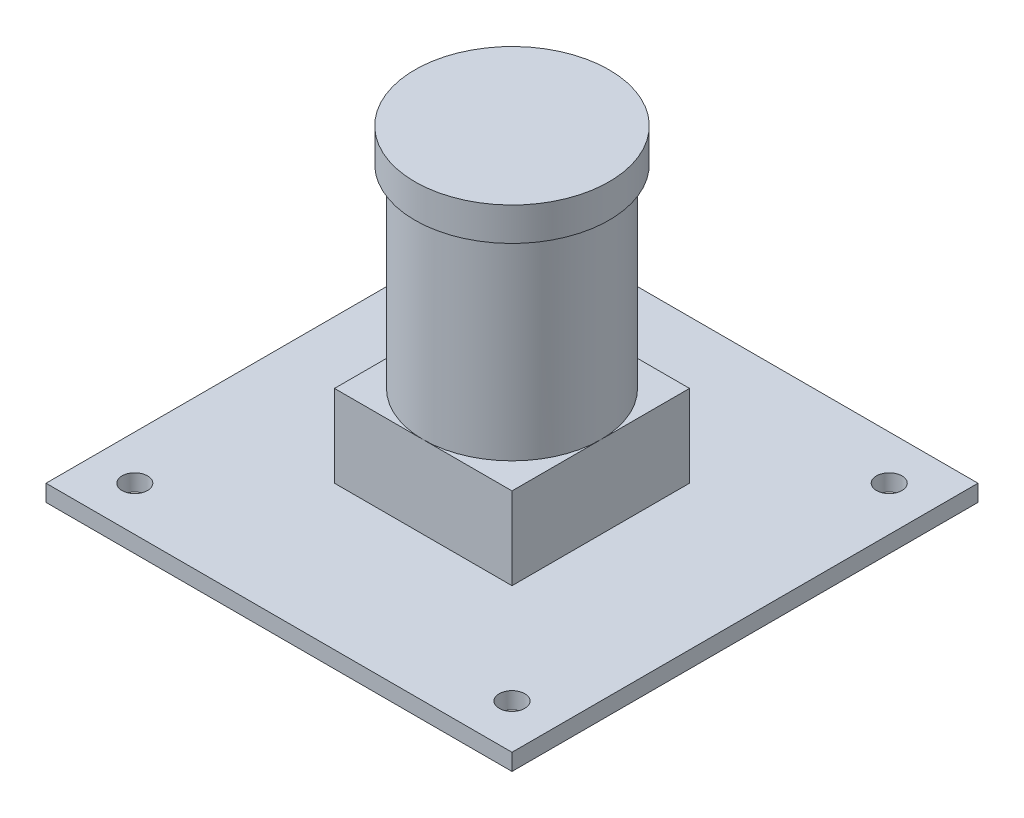
ISO-10303-21;
HEADER;
FILE_DESCRIPTION(('STEP AP214'),'2;1');
FILE_NAME('part.step','',(''),(''),'','','');
FILE_SCHEMA(('AUTOMOTIVE_DESIGN { 1 0 10303 214 1 1 1 1 }'));
ENDSEC;
DATA;
#1=APPLICATION_CONTEXT('core data for automotive mechanical design processes');
#2=APPLICATION_PROTOCOL_DEFINITION('international standard','automotive_design',2000,#1);
#3=PRODUCT_CONTEXT('',#1,'mechanical');
#4=PRODUCT('Part','Part','',(#3));
#5=PRODUCT_RELATED_PRODUCT_CATEGORY('part','',(#4));
#6=PRODUCT_DEFINITION_FORMATION('','',#4);
#7=PRODUCT_DEFINITION_CONTEXT('part definition',#1,'design');
#8=PRODUCT_DEFINITION('design','',#6,#7);
#9=PRODUCT_DEFINITION_SHAPE('','',#8);
#10=(LENGTH_UNIT() NAMED_UNIT(*) SI_UNIT(.MILLI.,.METRE.));
#11=(NAMED_UNIT(*) PLANE_ANGLE_UNIT() SI_UNIT($,.RADIAN.));
#12=(NAMED_UNIT(*) SI_UNIT($,.STERADIAN.) SOLID_ANGLE_UNIT());
#13=UNCERTAINTY_MEASURE_WITH_UNIT(LENGTH_MEASURE(1.E-05),#10,'distance_accuracy_value','');
#14=(GEOMETRIC_REPRESENTATION_CONTEXT(3) GLOBAL_UNCERTAINTY_ASSIGNED_CONTEXT((#13)) GLOBAL_UNIT_ASSIGNED_CONTEXT((#10,
#11,#12)) REPRESENTATION_CONTEXT('',''));
#15=CARTESIAN_POINT('',(0.,0.,0.));
#16=DIRECTION('',(0.,0.,1.));
#17=DIRECTION('',(1.,0.,0.));
#18=AXIS2_PLACEMENT_3D('',#15,#16,#17);
#19=CARTESIAN_POINT('',(0.,1.5,0.));
#20=DIRECTION('',(0.,1.,0.));
#21=DIRECTION('',(0.,0.,1.));
#22=AXIS2_PLACEMENT_3D('',#19,#20,#21);
#23=PLANE('',#22);
#24=CARTESIAN_POINT('',(17.,1.5,-17.));
#25=DIRECTION('',(0.,1.,0.));
#26=DIRECTION('',(0.,0.,1.));
#27=AXIS2_PLACEMENT_3D('',#24,#25,#26);
#28=CIRCLE('',#27,1.15);
#29=CARTESIAN_POINT('',(17.,1.5,-15.85));
#30=VERTEX_POINT('',#29);
#31=EDGE_CURVE('E156',#30,#30,#28,.T.);
#32=ORIENTED_EDGE('',*,*,#31,.F.);
#33=EDGE_LOOP('',(#32));
#34=FACE_BOUND('',#33,.T.);
#35=CARTESIAN_POINT('',(-17.,1.5,17.));
#36=DIRECTION('',(0.,1.,0.));
#37=DIRECTION('',(0.,0.,-1.));
#38=AXIS2_PLACEMENT_3D('',#35,#36,#37);
#39=CIRCLE('',#38,1.15);
#40=CARTESIAN_POINT('',(-17.,1.5,15.85));
#41=VERTEX_POINT('',#40);
#42=EDGE_CURVE('E155',#41,#41,#39,.T.);
#43=ORIENTED_EDGE('',*,*,#42,.F.);
#44=EDGE_LOOP('',(#43));
#45=FACE_BOUND('',#44,.T.);
#46=CARTESIAN_POINT('',(17.,1.5,17.));
#47=DIRECTION('',(0.,1.,0.));
#48=DIRECTION('',(0.,0.,-1.));
#49=AXIS2_PLACEMENT_3D('',#46,#47,#48);
#50=CIRCLE('',#49,1.15);
#51=CARTESIAN_POINT('',(17.,1.5,15.85));
#52=VERTEX_POINT('',#51);
#53=EDGE_CURVE('E146',#52,#52,#50,.T.);
#54=ORIENTED_EDGE('',*,*,#53,.F.);
#55=EDGE_LOOP('',(#54));
#56=FACE_BOUND('',#55,.T.);
#57=CARTESIAN_POINT('',(-17.,1.5,-17.));
#58=DIRECTION('',(0.,1.,0.));
#59=DIRECTION('',(0.,0.,1.));
#60=AXIS2_PLACEMENT_3D('',#57,#58,#59);
#61=CIRCLE('',#60,1.15);
#62=CARTESIAN_POINT('',(-17.,1.5,-15.85));
#63=VERTEX_POINT('',#62);
#64=EDGE_CURVE('E159',#63,#63,#61,.T.);
#65=ORIENTED_EDGE('',*,*,#64,.F.);
#66=EDGE_LOOP('',(#65));
#67=FACE_BOUND('',#66,.T.);
#68=DIRECTION('',(0.,0.,-1.));
#69=VECTOR('',#68,1.);
#70=CARTESIAN_POINT('',(21.,1.5,-21.));
#71=LINE('',#70,#69);
#72=CARTESIAN_POINT('',(21.,1.5,21.));
#73=VERTEX_POINT('',#72);
#74=CARTESIAN_POINT('',(21.,1.5,-21.));
#75=VERTEX_POINT('',#74);
#76=EDGE_CURVE('E165',#73,#75,#71,.T.);
#77=ORIENTED_EDGE('',*,*,#76,.T.);
#78=DIRECTION('',(-1.,0.,0.));
#79=VECTOR('',#78,1.);
#80=CARTESIAN_POINT('',(-21.,1.5,-21.));
#81=LINE('',#80,#79);
#82=CARTESIAN_POINT('',(-21.,1.5,-21.));
#83=VERTEX_POINT('',#82);
#84=EDGE_CURVE('E168',#75,#83,#81,.T.);
#85=ORIENTED_EDGE('',*,*,#84,.T.);
#86=DIRECTION('',(0.,0.,1.));
#87=VECTOR('',#86,1.);
#88=CARTESIAN_POINT('',(-21.,1.5,-21.));
#89=LINE('',#88,#87);
#90=CARTESIAN_POINT('',(-21.,1.5,21.));
#91=VERTEX_POINT('',#90);
#92=EDGE_CURVE('E171',#83,#91,#89,.T.);
#93=ORIENTED_EDGE('',*,*,#92,.T.);
#94=DIRECTION('',(1.,0.,0.));
#95=VECTOR('',#94,1.);
#96=CARTESIAN_POINT('',(-21.,1.5,21.));
#97=LINE('',#96,#95);
#98=EDGE_CURVE('E173',#91,#73,#97,.T.);
#99=ORIENTED_EDGE('',*,*,#98,.T.);
#100=EDGE_LOOP('',(#77,#85,#93,#99));
#101=FACE_BOUND('',#100,.T.);
#102=DIRECTION('',(0.,0.,1.));
#103=VECTOR('',#102,1.);
#104=CARTESIAN_POINT('',(-8.,1.5,-8.));
#105=LINE('',#104,#103);
#106=CARTESIAN_POINT('',(-8.,1.5,-8.));
#107=VERTEX_POINT('',#106);
#108=CARTESIAN_POINT('',(-8.,1.5,8.));
#109=VERTEX_POINT('',#108);
#110=EDGE_CURVE('E262',#107,#109,#105,.T.);
#111=ORIENTED_EDGE('',*,*,#110,.F.);
#112=DIRECTION('',(-1.,0.,0.));
#113=VECTOR('',#112,1.);
#114=CARTESIAN_POINT('',(-8.,1.5,-8.));
#115=LINE('',#114,#113);
#116=CARTESIAN_POINT('',(8.,1.5,-8.));
#117=VERTEX_POINT('',#116);
#118=EDGE_CURVE('E263',#117,#107,#115,.T.);
#119=ORIENTED_EDGE('',*,*,#118,.F.);
#120=DIRECTION('',(0.,0.,-1.));
#121=VECTOR('',#120,1.);
#122=CARTESIAN_POINT('',(8.,1.5,-8.));
#123=LINE('',#122,#121);
#124=CARTESIAN_POINT('',(8.,1.5,8.));
#125=VERTEX_POINT('',#124);
#126=EDGE_CURVE('E141',#125,#117,#123,.T.);
#127=ORIENTED_EDGE('',*,*,#126,.F.);
#128=DIRECTION('',(1.,0.,0.));
#129=VECTOR('',#128,1.);
#130=CARTESIAN_POINT('',(-8.,1.5,8.));
#131=LINE('',#130,#129);
#132=EDGE_CURVE('E55',#109,#125,#131,.T.);
#133=ORIENTED_EDGE('',*,*,#132,.F.);
#134=EDGE_LOOP('',(#111,#119,#127,#133));
#135=FACE_BOUND('',#134,.T.);
#136=ADVANCED_FACE('F39',(#34,#45,#56,#67,#101,#135),#23,.T.);
#137=CARTESIAN_POINT('',(21.,1.5,-21.));
#138=DIRECTION('',(-1.,0.,0.));
#139=DIRECTION('',(0.,0.,1.));
#140=AXIS2_PLACEMENT_3D('',#137,#138,#139);
#141=PLANE('',#140);
#142=DIRECTION('',(0.,0.,-1.));
#143=VECTOR('',#142,1.);
#144=CARTESIAN_POINT('',(21.,0.,-21.));
#145=LINE('',#144,#143);
#146=CARTESIAN_POINT('',(21.,0.,21.));
#147=VERTEX_POINT('',#146);
#148=CARTESIAN_POINT('',(21.,0.,-21.));
#149=VERTEX_POINT('',#148);
#150=EDGE_CURVE('E176',#147,#149,#145,.T.);
#151=ORIENTED_EDGE('',*,*,#150,.T.);
#152=DIRECTION('',(0.,-1.,0.));
#153=VECTOR('',#152,1.);
#154=CARTESIAN_POINT('',(21.,1.5,-21.));
#155=LINE('',#154,#153);
#156=EDGE_CURVE('E193',#75,#149,#155,.T.);
#157=ORIENTED_EDGE('',*,*,#156,.F.);
#158=ORIENTED_EDGE('',*,*,#76,.F.);
#159=DIRECTION('',(0.,-1.,0.));
#160=VECTOR('',#159,1.);
#161=CARTESIAN_POINT('',(21.,1.5,21.));
#162=LINE('',#161,#160);
#163=EDGE_CURVE('E175',#73,#147,#162,.T.);
#164=ORIENTED_EDGE('',*,*,#163,.T.);
#165=EDGE_LOOP('',(#151,#157,#158,#164));
#166=FACE_BOUND('',#165,.T.);
#167=ADVANCED_FACE('F41',(#166),#141,.F.);
#168=CARTESIAN_POINT('',(-21.,1.5,-21.));
#169=DIRECTION('',(0.,0.,1.));
#170=DIRECTION('',(1.,0.,0.));
#171=AXIS2_PLACEMENT_3D('',#168,#169,#170);
#172=PLANE('',#171);
#173=DIRECTION('',(-1.,0.,0.));
#174=VECTOR('',#173,1.);
#175=CARTESIAN_POINT('',(-21.,0.,-21.));
#176=LINE('',#175,#174);
#177=CARTESIAN_POINT('',(-21.,0.,-21.));
#178=VERTEX_POINT('',#177);
#179=EDGE_CURVE('E179',#149,#178,#176,.T.);
#180=ORIENTED_EDGE('',*,*,#179,.T.);
#181=DIRECTION('',(0.,-1.,0.));
#182=VECTOR('',#181,1.);
#183=CARTESIAN_POINT('',(-21.,1.5,-21.));
#184=LINE('',#183,#182);
#185=EDGE_CURVE('E190',#83,#178,#184,.T.);
#186=ORIENTED_EDGE('',*,*,#185,.F.);
#187=ORIENTED_EDGE('',*,*,#84,.F.);
#188=ORIENTED_EDGE('',*,*,#156,.T.);
#189=EDGE_LOOP('',(#180,#186,#187,#188));
#190=FACE_BOUND('',#189,.T.);
#191=ADVANCED_FACE('F229',(#190),#172,.F.);
#192=CARTESIAN_POINT('',(-21.,1.5,-21.));
#193=DIRECTION('',(1.,0.,0.));
#194=DIRECTION('',(0.,0.,-1.));
#195=AXIS2_PLACEMENT_3D('',#192,#193,#194);
#196=PLANE('',#195);
#197=DIRECTION('',(0.,0.,1.));
#198=VECTOR('',#197,1.);
#199=CARTESIAN_POINT('',(-21.,0.,-21.));
#200=LINE('',#199,#198);
#201=CARTESIAN_POINT('',(-21.,0.,21.));
#202=VERTEX_POINT('',#201);
#203=EDGE_CURVE('E182',#178,#202,#200,.T.);
#204=ORIENTED_EDGE('',*,*,#203,.T.);
#205=DIRECTION('',(0.,-1.,0.));
#206=VECTOR('',#205,1.);
#207=CARTESIAN_POINT('',(-21.,1.5,21.));
#208=LINE('',#207,#206);
#209=EDGE_CURVE('E187',#91,#202,#208,.T.);
#210=ORIENTED_EDGE('',*,*,#209,.F.);
#211=ORIENTED_EDGE('',*,*,#92,.F.);
#212=ORIENTED_EDGE('',*,*,#185,.T.);
#213=EDGE_LOOP('',(#204,#210,#211,#212));
#214=FACE_BOUND('',#213,.T.);
#215=ADVANCED_FACE('F241',(#214),#196,.F.);
#216=CARTESIAN_POINT('',(-21.,1.5,21.));
#217=DIRECTION('',(0.,0.,-1.));
#218=DIRECTION('',(-1.,0.,0.));
#219=AXIS2_PLACEMENT_3D('',#216,#217,#218);
#220=PLANE('',#219);
#221=DIRECTION('',(1.,0.,0.));
#222=VECTOR('',#221,1.);
#223=CARTESIAN_POINT('',(-21.,0.,21.));
#224=LINE('',#223,#222);
#225=EDGE_CURVE('E169',#202,#147,#224,.T.);
#226=ORIENTED_EDGE('',*,*,#225,.T.);
#227=ORIENTED_EDGE('',*,*,#163,.F.);
#228=ORIENTED_EDGE('',*,*,#98,.F.);
#229=ORIENTED_EDGE('',*,*,#209,.T.);
#230=EDGE_LOOP('',(#226,#227,#228,#229));
#231=FACE_BOUND('',#230,.T.);
#232=ADVANCED_FACE('F238',(#231),#220,.F.);
#233=CARTESIAN_POINT('',(0.,0.,0.));
#234=DIRECTION('',(0.,1.,0.));
#235=DIRECTION('',(0.,0.,1.));
#236=AXIS2_PLACEMENT_3D('',#233,#234,#235);
#237=PLANE('',#236);
#238=CARTESIAN_POINT('',(17.,0.,-17.));
#239=DIRECTION('',(0.,1.,0.));
#240=DIRECTION('',(0.,0.,1.));
#241=AXIS2_PLACEMENT_3D('',#238,#239,#240);
#242=CIRCLE('',#241,1.15);
#243=CARTESIAN_POINT('',(17.,0.,-15.85));
#244=VERTEX_POINT('',#243);
#245=EDGE_CURVE('E180',#244,#244,#242,.T.);
#246=ORIENTED_EDGE('',*,*,#245,.T.);
#247=EDGE_LOOP('',(#246));
#248=FACE_BOUND('',#247,.T.);
#249=CARTESIAN_POINT('',(-17.,0.,17.));
#250=DIRECTION('',(0.,1.,0.));
#251=DIRECTION('',(0.,0.,1.));
#252=AXIS2_PLACEMENT_3D('',#249,#250,#251);
#253=CIRCLE('',#252,1.15);
#254=CARTESIAN_POINT('',(-17.,0.,18.15));
#255=VERTEX_POINT('',#254);
#256=EDGE_CURVE('E201',#255,#255,#253,.T.);
#257=ORIENTED_EDGE('',*,*,#256,.T.);
#258=EDGE_LOOP('',(#257));
#259=FACE_BOUND('',#258,.T.);
#260=CARTESIAN_POINT('',(17.,0.,17.));
#261=DIRECTION('',(0.,1.,0.));
#262=DIRECTION('',(0.,0.,1.));
#263=AXIS2_PLACEMENT_3D('',#260,#261,#262);
#264=CIRCLE('',#263,1.15);
#265=CARTESIAN_POINT('',(17.,0.,18.15));
#266=VERTEX_POINT('',#265);
#267=EDGE_CURVE('E198',#266,#266,#264,.T.);
#268=ORIENTED_EDGE('',*,*,#267,.T.);
#269=EDGE_LOOP('',(#268));
#270=FACE_BOUND('',#269,.T.);
#271=CARTESIAN_POINT('',(-17.,0.,-17.));
#272=DIRECTION('',(0.,1.,0.));
#273=DIRECTION('',(0.,0.,1.));
#274=AXIS2_PLACEMENT_3D('',#271,#272,#273);
#275=CIRCLE('',#274,1.15);
#276=CARTESIAN_POINT('',(-17.,0.,-15.85));
#277=VERTEX_POINT('',#276);
#278=EDGE_CURVE('E164',#277,#277,#275,.T.);
#279=ORIENTED_EDGE('',*,*,#278,.T.);
#280=EDGE_LOOP('',(#279));
#281=FACE_BOUND('',#280,.T.);
#282=ORIENTED_EDGE('',*,*,#150,.F.);
#283=ORIENTED_EDGE('',*,*,#225,.F.);
#284=ORIENTED_EDGE('',*,*,#203,.F.);
#285=ORIENTED_EDGE('',*,*,#179,.F.);
#286=EDGE_LOOP('',(#282,#283,#284,#285));
#287=FACE_BOUND('',#286,.T.);
#288=ADVANCED_FACE('F206',(#248,#259,#270,#281,#287),#237,.F.);
#289=CARTESIAN_POINT('',(-17.,-0.5,-17.));
#290=DIRECTION('',(0.,1.,0.));
#291=DIRECTION('',(0.,0.,1.));
#292=AXIS2_PLACEMENT_3D('',#289,#290,#291);
#293=CYLINDRICAL_SURFACE('',#292,1.15);
#294=ORIENTED_EDGE('',*,*,#64,.T.);
#295=EDGE_LOOP('',(#294));
#296=FACE_BOUND('',#295,.T.);
#297=ORIENTED_EDGE('',*,*,#278,.F.);
#298=EDGE_LOOP('',(#297));
#299=FACE_BOUND('',#298,.T.);
#300=ADVANCED_FACE('F235',(#296,#299),#293,.F.);
#301=CARTESIAN_POINT('',(17.,-0.5,17.));
#302=DIRECTION('',(0.,1.,0.));
#303=DIRECTION('',(0.,0.,1.));
#304=AXIS2_PLACEMENT_3D('',#301,#302,#303);
#305=CYLINDRICAL_SURFACE('',#304,1.15);
#306=ORIENTED_EDGE('',*,*,#53,.T.);
#307=EDGE_LOOP('',(#306));
#308=FACE_BOUND('',#307,.T.);
#309=ORIENTED_EDGE('',*,*,#267,.F.);
#310=EDGE_LOOP('',(#309));
#311=FACE_BOUND('',#310,.T.);
#312=ADVANCED_FACE('F220',(#308,#311),#305,.F.);
#313=CARTESIAN_POINT('',(-17.,-0.5,17.));
#314=DIRECTION('',(0.,1.,0.));
#315=DIRECTION('',(0.,0.,1.));
#316=AXIS2_PLACEMENT_3D('',#313,#314,#315);
#317=CYLINDRICAL_SURFACE('',#316,1.15);
#318=ORIENTED_EDGE('',*,*,#42,.T.);
#319=EDGE_LOOP('',(#318));
#320=FACE_BOUND('',#319,.T.);
#321=ORIENTED_EDGE('',*,*,#256,.F.);
#322=EDGE_LOOP('',(#321));
#323=FACE_BOUND('',#322,.T.);
#324=ADVANCED_FACE('F211',(#320,#323),#317,.F.);
#325=CARTESIAN_POINT('',(17.,-0.5,-17.));
#326=DIRECTION('',(0.,1.,0.));
#327=DIRECTION('',(0.,0.,1.));
#328=AXIS2_PLACEMENT_3D('',#325,#326,#327);
#329=CYLINDRICAL_SURFACE('',#328,1.15);
#330=ORIENTED_EDGE('',*,*,#31,.T.);
#331=EDGE_LOOP('',(#330));
#332=FACE_BOUND('',#331,.T.);
#333=ORIENTED_EDGE('',*,*,#245,.F.);
#334=EDGE_LOOP('',(#333));
#335=FACE_BOUND('',#334,.T.);
#336=ADVANCED_FACE('F209',(#332,#335),#329,.F.);
#337=CARTESIAN_POINT('',(8.,8.9,-8.));
#338=DIRECTION('',(-1.,0.,0.));
#339=DIRECTION('',(0.,0.,1.));
#340=AXIS2_PLACEMENT_3D('',#337,#338,#339);
#341=PLANE('',#340);
#342=DIRECTION('',(0.,0.,-1.));
#343=VECTOR('',#342,1.);
#344=CARTESIAN_POINT('',(8.,8.9,-8.));
#345=LINE('',#344,#343);
#346=CARTESIAN_POINT('',(8.,8.9,0.));
#347=VERTEX_POINT('',#346);
#348=CARTESIAN_POINT('',(8.,8.9,-8.));
#349=VERTEX_POINT('',#348);
#350=EDGE_CURVE('E117',#347,#349,#345,.T.);
#351=ORIENTED_EDGE('',*,*,#350,.F.);
#352=CARTESIAN_POINT('',(8.,8.9,8.));
#353=VERTEX_POINT('',#352);
#354=EDGE_CURVE('E126',#353,#347,#345,.T.);
#355=ORIENTED_EDGE('',*,*,#354,.F.);
#356=DIRECTION('',(0.,-1.,0.));
#357=VECTOR('',#356,1.);
#358=CARTESIAN_POINT('',(8.,8.9,8.));
#359=LINE('',#358,#357);
#360=EDGE_CURVE('E279',#353,#125,#359,.T.);
#361=ORIENTED_EDGE('',*,*,#360,.T.);
#362=ORIENTED_EDGE('',*,*,#126,.T.);
#363=DIRECTION('',(0.,-1.,0.));
#364=VECTOR('',#363,1.);
#365=CARTESIAN_POINT('',(8.,8.9,-8.));
#366=LINE('',#365,#364);
#367=EDGE_CURVE('E133',#349,#117,#366,.T.);
#368=ORIENTED_EDGE('',*,*,#367,.F.);
#369=EDGE_LOOP('',(#351,#355,#361,#362,#368));
#370=FACE_BOUND('',#369,.T.);
#371=ADVANCED_FACE('F139',(#370),#341,.F.);
#372=CARTESIAN_POINT('',(-8.,8.9,-8.));
#373=DIRECTION('',(0.,0.,1.));
#374=DIRECTION('',(1.,0.,0.));
#375=AXIS2_PLACEMENT_3D('',#372,#373,#374);
#376=PLANE('',#375);
#377=DIRECTION('',(-1.,0.,0.));
#378=VECTOR('',#377,1.);
#379=CARTESIAN_POINT('',(-8.,8.9,-8.));
#380=LINE('',#379,#378);
#381=CARTESIAN_POINT('',(0.,8.9,-8.));
#382=VERTEX_POINT('',#381);
#383=CARTESIAN_POINT('',(-8.,8.9,-8.));
#384=VERTEX_POINT('',#383);
#385=EDGE_CURVE('E135',#382,#384,#380,.T.);
#386=ORIENTED_EDGE('',*,*,#385,.F.);
#387=EDGE_CURVE('E120',#349,#382,#380,.T.);
#388=ORIENTED_EDGE('',*,*,#387,.F.);
#389=ORIENTED_EDGE('',*,*,#367,.T.);
#390=ORIENTED_EDGE('',*,*,#118,.T.);
#391=DIRECTION('',(0.,-1.,0.));
#392=VECTOR('',#391,1.);
#393=CARTESIAN_POINT('',(-8.,8.9,-8.));
#394=LINE('',#393,#392);
#395=EDGE_CURVE('E143',#384,#107,#394,.T.);
#396=ORIENTED_EDGE('',*,*,#395,.F.);
#397=EDGE_LOOP('',(#386,#388,#389,#390,#396));
#398=FACE_BOUND('',#397,.T.);
#399=ADVANCED_FACE('F131',(#398),#376,.F.);
#400=CARTESIAN_POINT('',(-8.,8.9,-8.));
#401=DIRECTION('',(1.,0.,0.));
#402=DIRECTION('',(0.,0.,-1.));
#403=AXIS2_PLACEMENT_3D('',#400,#401,#402);
#404=PLANE('',#403);
#405=DIRECTION('',(0.,0.,1.));
#406=VECTOR('',#405,1.);
#407=CARTESIAN_POINT('',(-8.,8.9,-8.));
#408=LINE('',#407,#406);
#409=CARTESIAN_POINT('',(-8.,8.9,0.));
#410=VERTEX_POINT('',#409);
#411=CARTESIAN_POINT('',(-8.,8.9,8.));
#412=VERTEX_POINT('',#411);
#413=EDGE_CURVE('E136',#410,#412,#408,.T.);
#414=ORIENTED_EDGE('',*,*,#413,.F.);
#415=EDGE_CURVE('E272',#384,#410,#408,.T.);
#416=ORIENTED_EDGE('',*,*,#415,.F.);
#417=ORIENTED_EDGE('',*,*,#395,.T.);
#418=ORIENTED_EDGE('',*,*,#110,.T.);
#419=DIRECTION('',(0.,-1.,0.));
#420=VECTOR('',#419,1.);
#421=CARTESIAN_POINT('',(-8.,8.9,8.));
#422=LINE('',#421,#420);
#423=EDGE_CURVE('E149',#412,#109,#422,.T.);
#424=ORIENTED_EDGE('',*,*,#423,.F.);
#425=EDGE_LOOP('',(#414,#416,#417,#418,#424));
#426=FACE_BOUND('',#425,.T.);
#427=ADVANCED_FACE('F270',(#426),#404,.F.);
#428=CARTESIAN_POINT('',(-8.,8.9,8.));
#429=DIRECTION('',(0.,0.,-1.));
#430=DIRECTION('',(-1.,0.,0.));
#431=AXIS2_PLACEMENT_3D('',#428,#429,#430);
#432=PLANE('',#431);
#433=DIRECTION('',(1.,0.,0.));
#434=VECTOR('',#433,1.);
#435=CARTESIAN_POINT('',(-8.,8.9,8.));
#436=LINE('',#435,#434);
#437=CARTESIAN_POINT('',(0.,8.9,8.));
#438=VERTEX_POINT('',#437);
#439=EDGE_CURVE('E275',#438,#353,#436,.T.);
#440=ORIENTED_EDGE('',*,*,#439,.F.);
#441=EDGE_CURVE('E63',#412,#438,#436,.T.);
#442=ORIENTED_EDGE('',*,*,#441,.F.);
#443=ORIENTED_EDGE('',*,*,#423,.T.);
#444=ORIENTED_EDGE('',*,*,#132,.T.);
#445=ORIENTED_EDGE('',*,*,#360,.F.);
#446=EDGE_LOOP('',(#440,#442,#443,#444,#445));
#447=FACE_BOUND('',#446,.T.);
#448=ADVANCED_FACE('F284',(#447),#432,.F.);
#449=CARTESIAN_POINT('',(0.,8.9,0.));
#450=DIRECTION('',(0.,1.,0.));
#451=DIRECTION('',(0.,0.,1.));
#452=AXIS2_PLACEMENT_3D('',#449,#450,#451);
#453=PLANE('',#452);
#454=CARTESIAN_POINT('',(0.,8.9,0.));
#455=DIRECTION('',(0.,1.,0.));
#456=DIRECTION('',(0.,0.,1.));
#457=AXIS2_PLACEMENT_3D('',#454,#455,#456);
#458=CIRCLE('',#457,8.);
#459=EDGE_CURVE('E11',#438,#347,#458,.T.);
#460=ORIENTED_EDGE('',*,*,#459,.F.);
#461=ORIENTED_EDGE('',*,*,#439,.T.);
#462=ORIENTED_EDGE('',*,*,#354,.T.);
#463=EDGE_LOOP('',(#460,#461,#462));
#464=FACE_BOUND('',#463,.T.);
#465=ADVANCED_FACE('F289',(#464),#453,.T.);
#466=EDGE_CURVE('E48',#347,#382,#458,.T.);
#467=ORIENTED_EDGE('',*,*,#466,.F.);
#468=ORIENTED_EDGE('',*,*,#350,.T.);
#469=ORIENTED_EDGE('',*,*,#387,.T.);
#470=EDGE_LOOP('',(#467,#468,#469));
#471=FACE_BOUND('',#470,.T.);
#472=ADVANCED_FACE('F119',(#471),#453,.T.);
#473=EDGE_CURVE('E293',#382,#410,#458,.T.);
#474=ORIENTED_EDGE('',*,*,#473,.F.);
#475=ORIENTED_EDGE('',*,*,#385,.T.);
#476=ORIENTED_EDGE('',*,*,#415,.T.);
#477=EDGE_LOOP('',(#474,#475,#476));
#478=FACE_BOUND('',#477,.T.);
#479=ADVANCED_FACE('F296',(#478),#453,.T.);
#480=EDGE_CURVE('E43',#410,#438,#458,.T.);
#481=ORIENTED_EDGE('',*,*,#480,.F.);
#482=ORIENTED_EDGE('',*,*,#413,.T.);
#483=ORIENTED_EDGE('',*,*,#441,.T.);
#484=EDGE_LOOP('',(#481,#482,#483));
#485=FACE_BOUND('',#484,.T.);
#486=ADVANCED_FACE('F294',(#485),#453,.T.);
#487=CARTESIAN_POINT('',(0.,26.4,0.));
#488=DIRECTION('',(0.,-1.,0.));
#489=DIRECTION('',(0.,0.,-1.));
#490=AXIS2_PLACEMENT_3D('',#487,#488,#489);
#491=CYLINDRICAL_SURFACE('',#490,8.);
#492=ORIENTED_EDGE('',*,*,#480,.T.);
#493=ORIENTED_EDGE('',*,*,#459,.T.);
#494=ORIENTED_EDGE('',*,*,#466,.T.);
#495=ORIENTED_EDGE('',*,*,#473,.T.);
#496=EDGE_LOOP('',(#492,#493,#494,#495));
#497=FACE_BOUND('',#496,.T.);
#498=CARTESIAN_POINT('',(0.,26.4,0.));
#499=DIRECTION('',(0.,1.,0.));
#500=DIRECTION('',(0.,0.,1.));
#501=AXIS2_PLACEMENT_3D('',#498,#499,#500);
#502=CIRCLE('',#501,8.);
#503=CARTESIAN_POINT('',(0.,26.4,8.));
#504=VERTEX_POINT('',#503);
#505=EDGE_CURVE('E142',#504,#504,#502,.T.);
#506=ORIENTED_EDGE('',*,*,#505,.F.);
#507=EDGE_LOOP('',(#506));
#508=FACE_BOUND('',#507,.T.);
#509=ADVANCED_FACE('F291',(#497,#508),#491,.T.);
#510=CARTESIAN_POINT('',(0.,29.4,0.));
#511=DIRECTION('',(0.,-1.,0.));
#512=DIRECTION('',(0.,0.,-1.));
#513=AXIS2_PLACEMENT_3D('',#510,#511,#512);
#514=CYLINDRICAL_SURFACE('',#513,8.75);
#515=CARTESIAN_POINT('',(0.,29.4,0.));
#516=DIRECTION('',(0.,1.,0.));
#517=DIRECTION('',(0.,0.,1.));
#518=AXIS2_PLACEMENT_3D('',#515,#516,#517);
#519=CIRCLE('',#518,8.75);
#520=CARTESIAN_POINT('',(0.,29.4,8.75));
#521=VERTEX_POINT('',#520);
#522=EDGE_CURVE('E280',#521,#521,#519,.T.);
#523=ORIENTED_EDGE('',*,*,#522,.F.);
#524=EDGE_LOOP('',(#523));
#525=FACE_BOUND('',#524,.T.);
#526=CARTESIAN_POINT('',(0.,26.4,0.));
#527=DIRECTION('',(0.,1.,0.));
#528=DIRECTION('',(0.,0.,1.));
#529=AXIS2_PLACEMENT_3D('',#526,#527,#528);
#530=CIRCLE('',#529,8.75);
#531=CARTESIAN_POINT('',(0.,26.4,8.75));
#532=VERTEX_POINT('',#531);
#533=EDGE_CURVE('E459',#532,#532,#530,.T.);
#534=ORIENTED_EDGE('',*,*,#533,.T.);
#535=EDGE_LOOP('',(#534));
#536=FACE_BOUND('',#535,.T.);
#537=ADVANCED_FACE('F302',(#525,#536),#514,.T.);
#538=CARTESIAN_POINT('',(0.,29.4,0.));
#539=DIRECTION('',(0.,1.,0.));
#540=DIRECTION('',(0.,0.,1.));
#541=AXIS2_PLACEMENT_3D('',#538,#539,#540);
#542=PLANE('',#541);
#543=ORIENTED_EDGE('',*,*,#522,.T.);
#544=EDGE_LOOP('',(#543));
#545=FACE_BOUND('',#544,.T.);
#546=ADVANCED_FACE('F431',(#545),#542,.T.);
#547=CARTESIAN_POINT('',(0.,26.4,0.));
#548=DIRECTION('',(0.,1.,0.));
#549=DIRECTION('',(0.,0.,1.));
#550=AXIS2_PLACEMENT_3D('',#547,#548,#549);
#551=PLANE('',#550);
#552=ORIENTED_EDGE('',*,*,#505,.T.);
#553=EDGE_LOOP('',(#552));
#554=FACE_BOUND('',#553,.T.);
#555=ORIENTED_EDGE('',*,*,#533,.F.);
#556=EDGE_LOOP('',(#555));
#557=FACE_BOUND('',#556,.T.);
#558=ADVANCED_FACE('F439',(#554,#557),#551,.F.);
#559=CLOSED_SHELL('',(#136,#167,#191,#215,#232,#288,#300,#312,#324,#336,#371,#399,#427,#448,
#465,#472,#479,#486,#509,#537,#546,#558));
#560=MANIFOLD_SOLID_BREP('B2',#559);
#561=ADVANCED_BREP_SHAPE_REPRESENTATION('',(#18,#560),#14);
#562=SHAPE_DEFINITION_REPRESENTATION(#9,#561);
ENDSEC;
END-ISO-10303-21;
